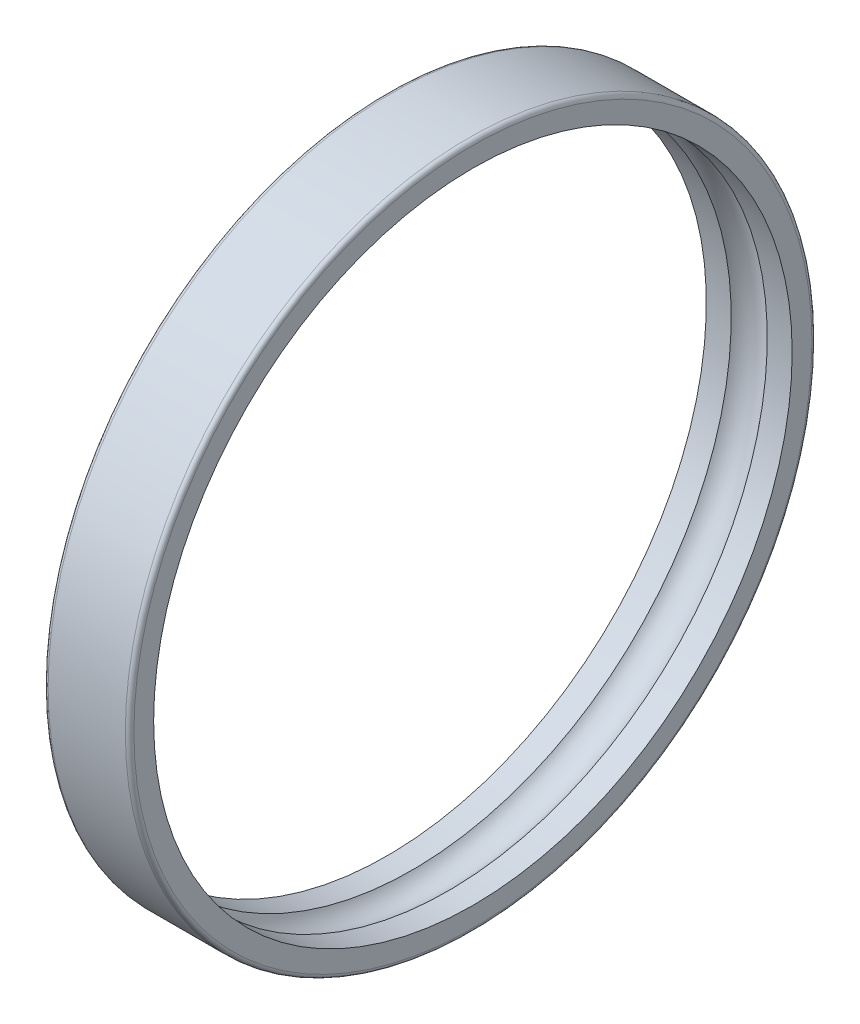
ISO-10303-21;
HEADER;
FILE_DESCRIPTION(('STEP AP214'),'2;1');
FILE_NAME('part.step','',(''),(''),'','','');
FILE_SCHEMA(('AUTOMOTIVE_DESIGN { 1 0 10303 214 1 1 1 1 }'));
ENDSEC;
DATA;
#1=APPLICATION_CONTEXT('core data for automotive mechanical design processes');
#2=APPLICATION_PROTOCOL_DEFINITION('international standard','automotive_design',2000,#1);
#3=PRODUCT_CONTEXT('',#1,'mechanical');
#4=PRODUCT('Part','Part','',(#3));
#5=PRODUCT_RELATED_PRODUCT_CATEGORY('part','',(#4));
#6=PRODUCT_DEFINITION_FORMATION('','',#4);
#7=PRODUCT_DEFINITION_CONTEXT('part definition',#1,'design');
#8=PRODUCT_DEFINITION('design','',#6,#7);
#9=PRODUCT_DEFINITION_SHAPE('','',#8);
#10=(LENGTH_UNIT() NAMED_UNIT(*) SI_UNIT(.MILLI.,.METRE.));
#11=(NAMED_UNIT(*) PLANE_ANGLE_UNIT() SI_UNIT($,.RADIAN.));
#12=(NAMED_UNIT(*) SI_UNIT($,.STERADIAN.) SOLID_ANGLE_UNIT());
#13=UNCERTAINTY_MEASURE_WITH_UNIT(LENGTH_MEASURE(1.E-05),#10,'distance_accuracy_value','');
#14=(GEOMETRIC_REPRESENTATION_CONTEXT(3) GLOBAL_UNCERTAINTY_ASSIGNED_CONTEXT((#13)) GLOBAL_UNIT_ASSIGNED_CONTEXT((#10,
#11,#12)) REPRESENTATION_CONTEXT('',''));
#15=CARTESIAN_POINT('',(0.,0.,0.));
#16=DIRECTION('',(0.,0.,1.));
#17=DIRECTION('',(1.,0.,0.));
#18=AXIS2_PLACEMENT_3D('',#15,#16,#17);
#19=CARTESIAN_POINT('',(0.,-16.093506231136,-15.8));
#20=DIRECTION('',(-1.,0.,0.));
#21=DIRECTION('',(0.,0.,1.));
#22=AXIS2_PLACEMENT_3D('',#19,#20,#21);
#23=PLANE('',#22);
#24=CARTESIAN_POINT('',(0.,0.,0.));
#25=DIRECTION('',(-1.,0.,0.));
#26=DIRECTION('',(0.,0.,-1.));
#27=AXIS2_PLACEMENT_3D('',#24,#25,#26);
#28=CIRCLE('',#27,15.7999999999995);
#29=CARTESIAN_POINT('',(0.,0.,-15.7999999999995));
#30=VERTEX_POINT('',#29);
#31=EDGE_CURVE('E44',#30,#30,#28,.F.);
#32=ORIENTED_EDGE('',*,*,#31,.F.);
#33=EDGE_LOOP('',(#32));
#34=FACE_BOUND('',#33,.T.);
#35=CARTESIAN_POINT('',(0.,0.,0.));
#36=DIRECTION('',(1.,0.,0.));
#37=DIRECTION('',(0.,-1.16843094339688E-09,1.));
#38=AXIS2_PLACEMENT_3D('',#35,#36,#37);
#39=CIRCLE('',#38,14.88);
#40=CARTESIAN_POINT('',(0.,-1.73862524377455E-08,14.88));
#41=VERTEX_POINT('',#40);
#42=EDGE_CURVE('E41',#41,#41,#39,.T.);
#43=ORIENTED_EDGE('',*,*,#42,.T.);
#44=EDGE_LOOP('',(#43));
#45=FACE_BOUND('',#44,.T.);
#46=ADVANCED_FACE('F15',(#34,#45),#23,.T.);
#47=CARTESIAN_POINT('',(4.,-16.093506231136,15.8));
#48=DIRECTION('',(1.,0.,0.));
#49=DIRECTION('',(0.,0.,-1.));
#50=AXIS2_PLACEMENT_3D('',#47,#48,#49);
#51=PLANE('',#50);
#52=CARTESIAN_POINT('',(4.,0.,0.));
#53=DIRECTION('',(1.,0.,0.));
#54=DIRECTION('',(0.,0.,1.));
#55=AXIS2_PLACEMENT_3D('',#52,#53,#54);
#56=CIRCLE('',#55,15.8000000264883);
#57=CARTESIAN_POINT('',(4.,0.,15.8000000264883));
#58=VERTEX_POINT('',#57);
#59=EDGE_CURVE('E38',#58,#58,#56,.T.);
#60=ORIENTED_EDGE('',*,*,#59,.T.);
#61=EDGE_LOOP('',(#60));
#62=FACE_BOUND('',#61,.T.);
#63=CARTESIAN_POINT('',(4.,0.,0.));
#64=DIRECTION('',(-1.,0.,0.));
#65=DIRECTION('',(0.,0.,-1.));
#66=AXIS2_PLACEMENT_3D('',#63,#64,#65);
#67=CIRCLE('',#66,14.88);
#68=CARTESIAN_POINT('',(4.,0.,-14.88));
#69=VERTEX_POINT('',#68);
#70=EDGE_CURVE('E35',#69,#69,#67,.F.);
#71=ORIENTED_EDGE('',*,*,#70,.F.);
#72=EDGE_LOOP('',(#71));
#73=FACE_BOUND('',#72,.T.);
#74=ADVANCED_FACE('F52',(#62,#73),#51,.T.);
#75=CARTESIAN_POINT('',(4.,0.,0.));
#76=DIRECTION('',(1.,0.,0.));
#77=DIRECTION('',(0.,0.,1.));
#78=AXIS2_PLACEMENT_3D('',#75,#76,#77);
#79=CYLINDRICAL_SURFACE('',#78,14.88);
#80=CARTESIAN_POINT('',(1.16,0.,0.));
#81=DIRECTION('',(1.,0.,0.));
#82=DIRECTION('',(0.,0.,1.));
#83=AXIS2_PLACEMENT_3D('',#80,#81,#82);
#84=CIRCLE('',#83,14.88);
#85=CARTESIAN_POINT('',(1.16,0.,14.88));
#86=VERTEX_POINT('',#85);
#87=EDGE_CURVE('E30',#86,#86,#84,.T.);
#88=ORIENTED_EDGE('',*,*,#87,.T.);
#89=EDGE_LOOP('',(#88));
#90=FACE_BOUND('',#89,.T.);
#91=ORIENTED_EDGE('',*,*,#42,.F.);
#92=EDGE_LOOP('',(#91));
#93=FACE_BOUND('',#92,.T.);
#94=ADVANCED_FACE('F56',(#90,#93),#79,.F.);
#95=CARTESIAN_POINT('',(2.,0.,0.));
#96=DIRECTION('',(1.,0.,0.));
#97=DIRECTION('',(0.,0.,1.));
#98=AXIS2_PLACEMENT_3D('',#95,#96,#97);
#99=TOROIDAL_SURFACE('',#98,14.25,1.05);
#100=ORIENTED_EDGE('',*,*,#87,.F.);
#101=EDGE_LOOP('',(#100));
#102=FACE_BOUND('',#101,.T.);
#103=CARTESIAN_POINT('',(2.84,0.,0.));
#104=DIRECTION('',(1.,0.,0.));
#105=DIRECTION('',(0.,0.,1.));
#106=AXIS2_PLACEMENT_3D('',#103,#104,#105);
#107=CIRCLE('',#106,14.88);
#108=CARTESIAN_POINT('',(2.84,0.,14.88));
#109=VERTEX_POINT('',#108);
#110=EDGE_CURVE('E26',#109,#109,#107,.T.);
#111=ORIENTED_EDGE('',*,*,#110,.T.);
#112=EDGE_LOOP('',(#111));
#113=FACE_BOUND('',#112,.T.);
#114=ADVANCED_FACE('F58',(#102,#113),#99,.F.);
#115=CARTESIAN_POINT('',(4.,0.,0.));
#116=DIRECTION('',(1.,0.,0.));
#117=DIRECTION('',(0.,0.,1.));
#118=AXIS2_PLACEMENT_3D('',#115,#116,#117);
#119=CYLINDRICAL_SURFACE('',#118,14.88);
#120=ORIENTED_EDGE('',*,*,#70,.T.);
#121=EDGE_LOOP('',(#120));
#122=FACE_BOUND('',#121,.T.);
#123=ORIENTED_EDGE('',*,*,#110,.F.);
#124=EDGE_LOOP('',(#123));
#125=FACE_BOUND('',#124,.T.);
#126=ADVANCED_FACE('F66',(#122,#125),#119,.F.);
#127=CARTESIAN_POINT('',(3.79999999999946,0.,0.));
#128=DIRECTION('',(1.,0.,0.));
#129=DIRECTION('',(0.,0.,1.));
#130=AXIS2_PLACEMENT_3D('',#127,#128,#129);
#131=TOROIDAL_SURFACE('',#130,15.7999999999995,0.200000000000541);
#132=CARTESIAN_POINT('',(3.79999999999946,0.,0.));
#133=DIRECTION('',(1.,0.,0.));
#134=DIRECTION('',(0.,0.,1.));
#135=AXIS2_PLACEMENT_3D('',#132,#133,#134);
#136=CIRCLE('',#135,16.);
#137=CARTESIAN_POINT('',(3.79999999999946,0.,16.));
#138=VERTEX_POINT('',#137);
#139=EDGE_CURVE('E22',#138,#138,#136,.T.);
#140=ORIENTED_EDGE('',*,*,#139,.T.);
#141=EDGE_LOOP('',(#140));
#142=FACE_BOUND('',#141,.T.);
#143=ORIENTED_EDGE('',*,*,#59,.F.);
#144=EDGE_LOOP('',(#143));
#145=FACE_BOUND('',#144,.T.);
#146=ADVANCED_FACE('F74',(#142,#145),#131,.T.);
#147=CARTESIAN_POINT('',(4.,0.,0.));
#148=DIRECTION('',(1.,0.,0.));
#149=DIRECTION('',(0.,0.,1.));
#150=AXIS2_PLACEMENT_3D('',#147,#148,#149);
#151=CYLINDRICAL_SURFACE('',#150,16.);
#152=CARTESIAN_POINT('',(0.2,0.,0.));
#153=DIRECTION('',(1.,0.,0.));
#154=DIRECTION('',(0.,0.,1.));
#155=AXIS2_PLACEMENT_3D('',#152,#153,#154);
#156=CIRCLE('',#155,16.);
#157=CARTESIAN_POINT('',(0.2,0.,16.));
#158=VERTEX_POINT('',#157);
#159=EDGE_CURVE('E10',#158,#158,#156,.T.);
#160=ORIENTED_EDGE('',*,*,#159,.T.);
#161=EDGE_LOOP('',(#160));
#162=FACE_BOUND('',#161,.T.);
#163=ORIENTED_EDGE('',*,*,#139,.F.);
#164=EDGE_LOOP('',(#163));
#165=FACE_BOUND('',#164,.T.);
#166=ADVANCED_FACE('F77',(#162,#165),#151,.T.);
#167=CARTESIAN_POINT('',(0.200000000000526,0.,0.));
#168=DIRECTION('',(1.,0.,0.));
#169=DIRECTION('',(0.,0.,1.));
#170=AXIS2_PLACEMENT_3D('',#167,#168,#169);
#171=TOROIDAL_SURFACE('',#170,15.7999999999995,0.200000000000526);
#172=ORIENTED_EDGE('',*,*,#31,.T.);
#173=EDGE_LOOP('',(#172));
#174=FACE_BOUND('',#173,.T.);
#175=ORIENTED_EDGE('',*,*,#159,.F.);
#176=EDGE_LOOP('',(#175));
#177=FACE_BOUND('',#176,.T.);
#178=ADVANCED_FACE('F17',(#174,#177),#171,.T.);
#179=CLOSED_SHELL('',(#46,#74,#94,#114,#126,#146,#166,#178));
#180=MANIFOLD_SOLID_BREP('B1',#179);
#181=ADVANCED_BREP_SHAPE_REPRESENTATION('',(#18,#180),#14);
#182=SHAPE_DEFINITION_REPRESENTATION(#9,#181);
ENDSEC;
END-ISO-10303-21;
